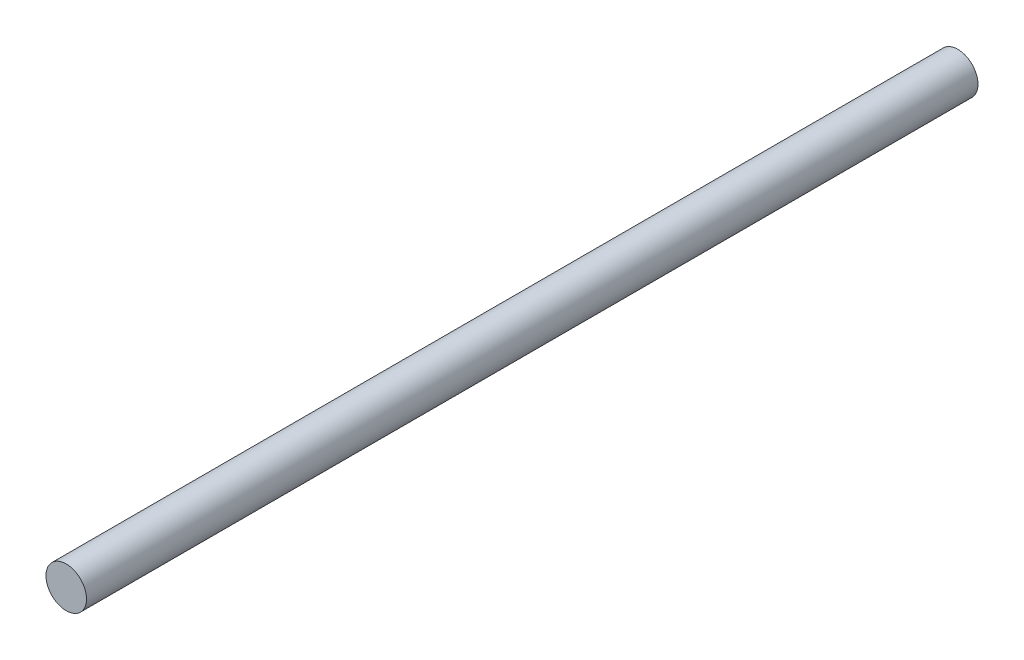
ISO-10303-21;
HEADER;
FILE_DESCRIPTION(('STEP AP214'),'2;1');
FILE_NAME('part.step','',(''),(''),'','','');
FILE_SCHEMA(('AUTOMOTIVE_DESIGN { 1 0 10303 214 1 1 1 1 }'));
ENDSEC;
DATA;
#1=APPLICATION_CONTEXT('core data for automotive mechanical design processes');
#2=APPLICATION_PROTOCOL_DEFINITION('international standard','automotive_design',2000,#1);
#3=PRODUCT_CONTEXT('',#1,'mechanical');
#4=PRODUCT('Part','Part','',(#3));
#5=PRODUCT_RELATED_PRODUCT_CATEGORY('part','',(#4));
#6=PRODUCT_DEFINITION_FORMATION('','',#4);
#7=PRODUCT_DEFINITION_CONTEXT('part definition',#1,'design');
#8=PRODUCT_DEFINITION('design','',#6,#7);
#9=PRODUCT_DEFINITION_SHAPE('','',#8);
#10=(LENGTH_UNIT() NAMED_UNIT(*) SI_UNIT(.MILLI.,.METRE.));
#11=(NAMED_UNIT(*) PLANE_ANGLE_UNIT() SI_UNIT($,.RADIAN.));
#12=(NAMED_UNIT(*) SI_UNIT($,.STERADIAN.) SOLID_ANGLE_UNIT());
#13=UNCERTAINTY_MEASURE_WITH_UNIT(LENGTH_MEASURE(1.E-05),#10,'distance_accuracy_value','');
#14=(GEOMETRIC_REPRESENTATION_CONTEXT(3) GLOBAL_UNCERTAINTY_ASSIGNED_CONTEXT((#13)) GLOBAL_UNIT_ASSIGNED_CONTEXT((#10,
#11,#12)) REPRESENTATION_CONTEXT('',''));
#15=CARTESIAN_POINT('',(0.,0.,0.));
#16=DIRECTION('',(0.,0.,1.));
#17=DIRECTION('',(1.,0.,0.));
#18=AXIS2_PLACEMENT_3D('',#15,#16,#17);
#19=CARTESIAN_POINT('',(0.,0.,139.7));
#20=DIRECTION('',(0.,0.,-1.));
#21=DIRECTION('',(-1.,0.,0.));
#22=AXIS2_PLACEMENT_3D('',#19,#20,#21);
#23=CYLINDRICAL_SURFACE('',#22,3.175);
#24=CARTESIAN_POINT('',(0.,0.,139.7));
#25=DIRECTION('',(0.,0.,1.));
#26=DIRECTION('',(1.,0.,0.));
#27=AXIS2_PLACEMENT_3D('',#24,#25,#26);
#28=CIRCLE('',#27,3.175);
#29=CARTESIAN_POINT('',(3.175,0.,139.7));
#30=VERTEX_POINT('',#29);
#31=EDGE_CURVE('E10',#30,#30,#28,.T.);
#32=ORIENTED_EDGE('',*,*,#31,.F.);
#33=EDGE_LOOP('',(#32));
#34=FACE_BOUND('',#33,.T.);
#35=CARTESIAN_POINT('',(0.,0.,0.));
#36=DIRECTION('',(0.,0.,1.));
#37=DIRECTION('',(1.,0.,0.));
#38=AXIS2_PLACEMENT_3D('',#35,#36,#37);
#39=CIRCLE('',#38,3.175);
#40=CARTESIAN_POINT('',(3.175,0.,0.));
#41=VERTEX_POINT('',#40);
#42=EDGE_CURVE('E48',#41,#41,#39,.T.);
#43=ORIENTED_EDGE('',*,*,#42,.T.);
#44=EDGE_LOOP('',(#43));
#45=FACE_BOUND('',#44,.T.);
#46=ADVANCED_FACE('F45',(#34,#45),#23,.T.);
#47=CARTESIAN_POINT('',(0.,0.,139.7));
#48=DIRECTION('',(0.,0.,1.));
#49=DIRECTION('',(1.,0.,0.));
#50=AXIS2_PLACEMENT_3D('',#47,#48,#49);
#51=PLANE('',#50);
#52=ORIENTED_EDGE('',*,*,#31,.T.);
#53=EDGE_LOOP('',(#52));
#54=FACE_BOUND('',#53,.T.);
#55=ADVANCED_FACE('F62',(#54),#51,.T.);
#56=CARTESIAN_POINT('',(0.,0.,0.));
#57=DIRECTION('',(0.,0.,1.));
#58=DIRECTION('',(1.,0.,0.));
#59=AXIS2_PLACEMENT_3D('',#56,#57,#58);
#60=PLANE('',#59);
#61=ORIENTED_EDGE('',*,*,#42,.F.);
#62=EDGE_LOOP('',(#61));
#63=FACE_BOUND('',#62,.T.);
#64=ADVANCED_FACE('F60',(#63),#60,.F.);
#65=CLOSED_SHELL('',(#46,#55,#64));
#66=MANIFOLD_SOLID_BREP('B2',#65);
#67=ADVANCED_BREP_SHAPE_REPRESENTATION('',(#18,#66),#14);
#68=SHAPE_DEFINITION_REPRESENTATION(#9,#67);
ENDSEC;
END-ISO-10303-21;
